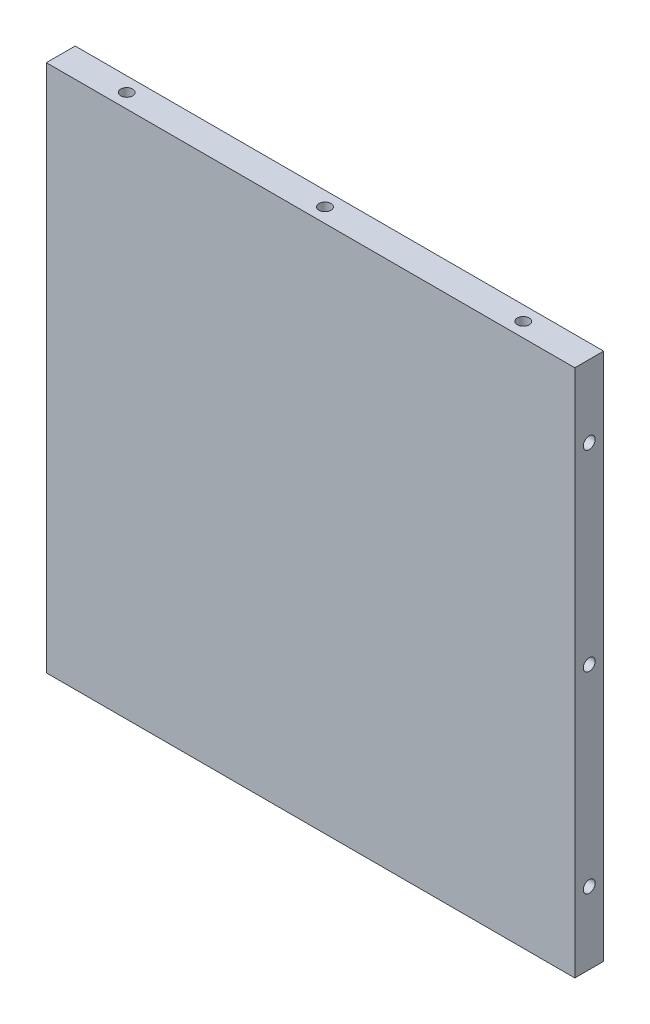
ISO-10303-21;
HEADER;
FILE_DESCRIPTION(('STEP AP214'),'2;1');
FILE_NAME('part.step','',(''),(''),'','','');
FILE_SCHEMA(('AUTOMOTIVE_DESIGN { 1 0 10303 214 1 1 1 1 }'));
ENDSEC;
DATA;
#1=APPLICATION_CONTEXT('core data for automotive mechanical design processes');
#2=APPLICATION_PROTOCOL_DEFINITION('international standard','automotive_design',2000,#1);
#3=PRODUCT_CONTEXT('',#1,'mechanical');
#4=PRODUCT('Part','Part','',(#3));
#5=PRODUCT_RELATED_PRODUCT_CATEGORY('part','',(#4));
#6=PRODUCT_DEFINITION_FORMATION('','',#4);
#7=PRODUCT_DEFINITION_CONTEXT('part definition',#1,'design');
#8=PRODUCT_DEFINITION('design','',#6,#7);
#9=PRODUCT_DEFINITION_SHAPE('','',#8);
#10=(LENGTH_UNIT() NAMED_UNIT(*) SI_UNIT(.MILLI.,.METRE.));
#11=(NAMED_UNIT(*) PLANE_ANGLE_UNIT() SI_UNIT($,.RADIAN.));
#12=(NAMED_UNIT(*) SI_UNIT($,.STERADIAN.) SOLID_ANGLE_UNIT());
#13=UNCERTAINTY_MEASURE_WITH_UNIT(LENGTH_MEASURE(1.E-05),#10,'distance_accuracy_value','');
#14=(GEOMETRIC_REPRESENTATION_CONTEXT(3) GLOBAL_UNCERTAINTY_ASSIGNED_CONTEXT((#13)) GLOBAL_UNIT_ASSIGNED_CONTEXT((#10,
#11,#12)) REPRESENTATION_CONTEXT('',''));
#15=CARTESIAN_POINT('',(0.,0.,0.));
#16=DIRECTION('',(0.,0.,1.));
#17=DIRECTION('',(1.,0.,0.));
#18=AXIS2_PLACEMENT_3D('',#15,#16,#17);
#19=CARTESIAN_POINT('',(128.3,146.6,4.));
#20=DIRECTION('',(0.,-1.,0.));
#21=DIRECTION('',(0.,0.,-1.));
#22=AXIS2_PLACEMENT_3D('',#19,#20,#21);
#23=CYLINDRICAL_SURFACE('',#22,1.65000000000002);
#24=CARTESIAN_POINT('',(128.3,15.,4.));
#25=DIRECTION('',(0.,-1.,0.));
#26=DIRECTION('',(1.,0.,0.));
#27=AXIS2_PLACEMENT_3D('',#24,#25,#26);
#28=CIRCLE('',#27,1.65000000000002);
#29=CARTESIAN_POINT('',(129.95,15.,4.));
#30=VERTEX_POINT('',#29);
#31=EDGE_CURVE('E146',#30,#30,#28,.F.);
#32=ORIENTED_EDGE('',*,*,#31,.T.);
#33=EDGE_LOOP('',(#32));
#34=FACE_BOUND('',#33,.T.);
#35=CARTESIAN_POINT('',(128.3,0.,4.));
#36=DIRECTION('',(0.,-1.,0.));
#37=DIRECTION('',(0.,0.,-1.));
#38=AXIS2_PLACEMENT_3D('',#35,#36,#37);
#39=CIRCLE('',#38,1.65000000000002);
#40=CARTESIAN_POINT('',(128.3,0.,2.34999999999998));
#41=VERTEX_POINT('',#40);
#42=EDGE_CURVE('E153',#41,#41,#39,.T.);
#43=ORIENTED_EDGE('',*,*,#42,.T.);
#44=EDGE_LOOP('',(#43));
#45=FACE_BOUND('',#44,.T.);
#46=ADVANCED_FACE('F37',(#34,#45),#23,.F.);
#47=CARTESIAN_POINT('',(73.3,146.6,4.));
#48=DIRECTION('',(0.,-1.,0.));
#49=DIRECTION('',(0.,0.,-1.));
#50=AXIS2_PLACEMENT_3D('',#47,#48,#49);
#51=CYLINDRICAL_SURFACE('',#50,1.64999999999999);
#52=CARTESIAN_POINT('',(73.3,15.,4.));
#53=DIRECTION('',(0.,-1.,0.));
#54=DIRECTION('',(1.,0.,0.));
#55=AXIS2_PLACEMENT_3D('',#52,#53,#54);
#56=CIRCLE('',#55,1.64999999999999);
#57=CARTESIAN_POINT('',(74.95,15.,4.));
#58=VERTEX_POINT('',#57);
#59=EDGE_CURVE('E143',#58,#58,#56,.F.);
#60=ORIENTED_EDGE('',*,*,#59,.T.);
#61=EDGE_LOOP('',(#60));
#62=FACE_BOUND('',#61,.T.);
#63=CARTESIAN_POINT('',(73.3,0.,4.));
#64=DIRECTION('',(0.,-1.,0.));
#65=DIRECTION('',(0.,0.,-1.));
#66=AXIS2_PLACEMENT_3D('',#63,#64,#65);
#67=CIRCLE('',#66,1.64999999999999);
#68=CARTESIAN_POINT('',(73.3,0.,2.35000000000001));
#69=VERTEX_POINT('',#68);
#70=EDGE_CURVE('E176',#69,#69,#67,.T.);
#71=ORIENTED_EDGE('',*,*,#70,.T.);
#72=EDGE_LOOP('',(#71));
#73=FACE_BOUND('',#72,.T.);
#74=ADVANCED_FACE('F201',(#62,#73),#51,.F.);
#75=CARTESIAN_POINT('',(18.3,146.6,4.));
#76=DIRECTION('',(0.,-1.,0.));
#77=DIRECTION('',(0.,0.,-1.));
#78=AXIS2_PLACEMENT_3D('',#75,#76,#77);
#79=CYLINDRICAL_SURFACE('',#78,1.65);
#80=CARTESIAN_POINT('',(18.3,15.,4.));
#81=DIRECTION('',(0.,-1.,0.));
#82=DIRECTION('',(1.,0.,0.));
#83=AXIS2_PLACEMENT_3D('',#80,#81,#82);
#84=CIRCLE('',#83,1.65);
#85=CARTESIAN_POINT('',(19.95,15.,4.));
#86=VERTEX_POINT('',#85);
#87=EDGE_CURVE('E140',#86,#86,#84,.F.);
#88=ORIENTED_EDGE('',*,*,#87,.T.);
#89=EDGE_LOOP('',(#88));
#90=FACE_BOUND('',#89,.T.);
#91=CARTESIAN_POINT('',(18.3,0.,4.));
#92=DIRECTION('',(0.,-1.,0.));
#93=DIRECTION('',(0.,0.,-1.));
#94=AXIS2_PLACEMENT_3D('',#91,#92,#93);
#95=CIRCLE('',#94,1.65);
#96=CARTESIAN_POINT('',(18.3,0.,2.35));
#97=VERTEX_POINT('',#96);
#98=EDGE_CURVE('E170',#97,#97,#95,.T.);
#99=ORIENTED_EDGE('',*,*,#98,.T.);
#100=EDGE_LOOP('',(#99));
#101=FACE_BOUND('',#100,.T.);
#102=ADVANCED_FACE('F196',(#90,#101),#79,.F.);
#103=CARTESIAN_POINT('',(0.,0.,8.));
#104=DIRECTION('',(1.,0.,0.));
#105=DIRECTION('',(0.,1.,0.));
#106=AXIS2_PLACEMENT_3D('',#103,#104,#105);
#107=PLANE('',#106);
#108=CARTESIAN_POINT('',(0.,20.,4.));
#109=DIRECTION('',(-1.,0.,0.));
#110=DIRECTION('',(0.,-1.,0.));
#111=AXIS2_PLACEMENT_3D('',#108,#109,#110);
#112=CIRCLE('',#111,1.65);
#113=CARTESIAN_POINT('',(0.,18.35,4.));
#114=VERTEX_POINT('',#113);
#115=EDGE_CURVE('E154',#114,#114,#112,.T.);
#116=ORIENTED_EDGE('',*,*,#115,.F.);
#117=EDGE_LOOP('',(#116));
#118=FACE_BOUND('',#117,.T.);
#119=CARTESIAN_POINT('',(0.,73.3,3.99999999999982));
#120=DIRECTION('',(-1.,0.,0.));
#121=DIRECTION('',(0.,-1.,0.));
#122=AXIS2_PLACEMENT_3D('',#119,#120,#121);
#123=CIRCLE('',#122,1.65);
#124=CARTESIAN_POINT('',(0.,71.65,3.99999999999982));
#125=VERTEX_POINT('',#124);
#126=EDGE_CURVE('E160',#125,#125,#123,.T.);
#127=ORIENTED_EDGE('',*,*,#126,.F.);
#128=EDGE_LOOP('',(#127));
#129=FACE_BOUND('',#128,.T.);
#130=CARTESIAN_POINT('',(0.,126.6,3.99999999999963));
#131=DIRECTION('',(-1.,0.,0.));
#132=DIRECTION('',(0.,-1.,0.));
#133=AXIS2_PLACEMENT_3D('',#130,#131,#132);
#134=CIRCLE('',#133,1.65);
#135=CARTESIAN_POINT('',(0.,124.95,3.99999999999963));
#136=VERTEX_POINT('',#135);
#137=EDGE_CURVE('E149',#136,#136,#134,.T.);
#138=ORIENTED_EDGE('',*,*,#137,.F.);
#139=EDGE_LOOP('',(#138));
#140=FACE_BOUND('',#139,.T.);
#141=DIRECTION('',(0.,-1.,0.));
#142=VECTOR('',#141,1.);
#143=CARTESIAN_POINT('',(0.,0.,0.));
#144=LINE('',#143,#142);
#145=CARTESIAN_POINT('',(0.,146.6,0.));
#146=VERTEX_POINT('',#145);
#147=CARTESIAN_POINT('',(0.,0.,0.));
#148=VERTEX_POINT('',#147);
#149=EDGE_CURVE('E104',#146,#148,#144,.T.);
#150=ORIENTED_EDGE('',*,*,#149,.T.);
#151=DIRECTION('',(0.,0.,-1.));
#152=VECTOR('',#151,1.);
#153=CARTESIAN_POINT('',(0.,0.,8.));
#154=LINE('',#153,#152);
#155=CARTESIAN_POINT('',(0.,0.,8.));
#156=VERTEX_POINT('',#155);
#157=EDGE_CURVE('E11',#156,#148,#154,.T.);
#158=ORIENTED_EDGE('',*,*,#157,.F.);
#159=DIRECTION('',(0.,-1.,0.));
#160=VECTOR('',#159,1.);
#161=CARTESIAN_POINT('',(0.,0.,8.));
#162=LINE('',#161,#160);
#163=CARTESIAN_POINT('',(0.,146.6,8.));
#164=VERTEX_POINT('',#163);
#165=EDGE_CURVE('E91',#164,#156,#162,.T.);
#166=ORIENTED_EDGE('',*,*,#165,.F.);
#167=DIRECTION('',(0.,0.,-1.));
#168=VECTOR('',#167,1.);
#169=CARTESIAN_POINT('',(0.,146.6,8.));
#170=LINE('',#169,#168);
#171=EDGE_CURVE('E100',#164,#146,#170,.T.);
#172=ORIENTED_EDGE('',*,*,#171,.T.);
#173=EDGE_LOOP('',(#150,#158,#166,#172));
#174=FACE_BOUND('',#173,.T.);
#175=ADVANCED_FACE('F39',(#118,#129,#140,#174),#107,.F.);
#176=CARTESIAN_POINT('',(0.,0.,8.));
#177=DIRECTION('',(0.,1.,0.));
#178=DIRECTION('',(0.,0.,1.));
#179=AXIS2_PLACEMENT_3D('',#176,#177,#178);
#180=PLANE('',#179);
#181=ORIENTED_EDGE('',*,*,#98,.F.);
#182=EDGE_LOOP('',(#181));
#183=FACE_BOUND('',#182,.T.);
#184=ORIENTED_EDGE('',*,*,#70,.F.);
#185=EDGE_LOOP('',(#184));
#186=FACE_BOUND('',#185,.T.);
#187=ORIENTED_EDGE('',*,*,#42,.F.);
#188=EDGE_LOOP('',(#187));
#189=FACE_BOUND('',#188,.T.);
#190=DIRECTION('',(1.,0.,0.));
#191=VECTOR('',#190,1.);
#192=CARTESIAN_POINT('',(0.,0.,0.));
#193=LINE('',#192,#191);
#194=CARTESIAN_POINT('',(146.6,0.,0.));
#195=VERTEX_POINT('',#194);
#196=EDGE_CURVE('E95',#148,#195,#193,.T.);
#197=ORIENTED_EDGE('',*,*,#196,.T.);
#198=DIRECTION('',(0.,0.,-1.));
#199=VECTOR('',#198,1.);
#200=CARTESIAN_POINT('',(146.6,0.,8.));
#201=LINE('',#200,#199);
#202=CARTESIAN_POINT('',(146.6,0.,8.));
#203=VERTEX_POINT('',#202);
#204=EDGE_CURVE('E47',#203,#195,#201,.T.);
#205=ORIENTED_EDGE('',*,*,#204,.F.);
#206=DIRECTION('',(1.,0.,0.));
#207=VECTOR('',#206,1.);
#208=CARTESIAN_POINT('',(0.,0.,8.));
#209=LINE('',#208,#207);
#210=EDGE_CURVE('E86',#156,#203,#209,.T.);
#211=ORIENTED_EDGE('',*,*,#210,.F.);
#212=ORIENTED_EDGE('',*,*,#157,.T.);
#213=EDGE_LOOP('',(#197,#205,#211,#212));
#214=FACE_BOUND('',#213,.T.);
#215=ADVANCED_FACE('F94',(#183,#186,#189,#214),#180,.F.);
#216=CARTESIAN_POINT('',(146.6,0.,8.));
#217=DIRECTION('',(-1.,0.,0.));
#218=DIRECTION('',(0.,-1.,0.));
#219=AXIS2_PLACEMENT_3D('',#216,#217,#218);
#220=PLANE('',#219);
#221=CARTESIAN_POINT('',(146.6,20.,4.));
#222=DIRECTION('',(-1.,0.,0.));
#223=DIRECTION('',(0.,-1.,0.));
#224=AXIS2_PLACEMENT_3D('',#221,#222,#223);
#225=CIRCLE('',#224,1.65);
#226=CARTESIAN_POINT('',(146.6,18.35,4.));
#227=VERTEX_POINT('',#226);
#228=EDGE_CURVE('E150',#227,#227,#225,.T.);
#229=ORIENTED_EDGE('',*,*,#228,.T.);
#230=EDGE_LOOP('',(#229));
#231=FACE_BOUND('',#230,.T.);
#232=CARTESIAN_POINT('',(146.6,73.3,3.99999999999982));
#233=DIRECTION('',(-1.,0.,0.));
#234=DIRECTION('',(0.,-1.,0.));
#235=AXIS2_PLACEMENT_3D('',#232,#233,#234);
#236=CIRCLE('',#235,1.65);
#237=CARTESIAN_POINT('',(146.6,71.65,3.99999999999982));
#238=VERTEX_POINT('',#237);
#239=EDGE_CURVE('E157',#238,#238,#236,.T.);
#240=ORIENTED_EDGE('',*,*,#239,.T.);
#241=EDGE_LOOP('',(#240));
#242=FACE_BOUND('',#241,.T.);
#243=CARTESIAN_POINT('',(146.6,126.6,3.99999999999963));
#244=DIRECTION('',(-1.,0.,0.));
#245=DIRECTION('',(0.,-1.,0.));
#246=AXIS2_PLACEMENT_3D('',#243,#244,#245);
#247=CIRCLE('',#246,1.65);
#248=CARTESIAN_POINT('',(146.6,124.95,3.99999999999963));
#249=VERTEX_POINT('',#248);
#250=EDGE_CURVE('E163',#249,#249,#247,.T.);
#251=ORIENTED_EDGE('',*,*,#250,.T.);
#252=EDGE_LOOP('',(#251));
#253=FACE_BOUND('',#252,.T.);
#254=DIRECTION('',(0.,1.,0.));
#255=VECTOR('',#254,1.);
#256=CARTESIAN_POINT('',(146.6,0.,0.));
#257=LINE('',#256,#255);
#258=CARTESIAN_POINT('',(146.6,146.6,0.));
#259=VERTEX_POINT('',#258);
#260=EDGE_CURVE('E73',#195,#259,#257,.T.);
#261=ORIENTED_EDGE('',*,*,#260,.T.);
#262=DIRECTION('',(0.,0.,-1.));
#263=VECTOR('',#262,1.);
#264=CARTESIAN_POINT('',(146.6,146.6,8.));
#265=LINE('',#264,#263);
#266=CARTESIAN_POINT('',(146.6,146.6,8.));
#267=VERTEX_POINT('',#266);
#268=EDGE_CURVE('E96',#267,#259,#265,.T.);
#269=ORIENTED_EDGE('',*,*,#268,.F.);
#270=DIRECTION('',(0.,1.,0.));
#271=VECTOR('',#270,1.);
#272=CARTESIAN_POINT('',(146.6,0.,8.));
#273=LINE('',#272,#271);
#274=EDGE_CURVE('E89',#203,#267,#273,.T.);
#275=ORIENTED_EDGE('',*,*,#274,.F.);
#276=ORIENTED_EDGE('',*,*,#204,.T.);
#277=EDGE_LOOP('',(#261,#269,#275,#276));
#278=FACE_BOUND('',#277,.T.);
#279=ADVANCED_FACE('F98',(#231,#242,#253,#278),#220,.F.);
#280=CARTESIAN_POINT('',(0.,146.6,8.));
#281=DIRECTION('',(0.,-1.,0.));
#282=DIRECTION('',(0.,0.,-1.));
#283=AXIS2_PLACEMENT_3D('',#280,#281,#282);
#284=PLANE('',#283);
#285=CARTESIAN_POINT('',(18.3,146.6,4.));
#286=DIRECTION('',(0.,-1.,0.));
#287=DIRECTION('',(0.,0.,-1.));
#288=AXIS2_PLACEMENT_3D('',#285,#286,#287);
#289=CIRCLE('',#288,1.65);
#290=CARTESIAN_POINT('',(18.3,146.6,2.35));
#291=VERTEX_POINT('',#290);
#292=EDGE_CURVE('E107',#291,#291,#289,.T.);
#293=ORIENTED_EDGE('',*,*,#292,.T.);
#294=EDGE_LOOP('',(#293));
#295=FACE_BOUND('',#294,.T.);
#296=CARTESIAN_POINT('',(73.3,146.6,4.));
#297=DIRECTION('',(0.,-1.,0.));
#298=DIRECTION('',(0.,0.,-1.));
#299=AXIS2_PLACEMENT_3D('',#296,#297,#298);
#300=CIRCLE('',#299,1.64999999999999);
#301=CARTESIAN_POINT('',(73.3,146.6,2.35000000000001));
#302=VERTEX_POINT('',#301);
#303=EDGE_CURVE('E173',#302,#302,#300,.T.);
#304=ORIENTED_EDGE('',*,*,#303,.T.);
#305=EDGE_LOOP('',(#304));
#306=FACE_BOUND('',#305,.T.);
#307=CARTESIAN_POINT('',(128.3,146.6,4.));
#308=DIRECTION('',(0.,-1.,0.));
#309=DIRECTION('',(0.,0.,-1.));
#310=AXIS2_PLACEMENT_3D('',#307,#308,#309);
#311=CIRCLE('',#310,1.65000000000002);
#312=CARTESIAN_POINT('',(128.3,146.6,2.34999999999998));
#313=VERTEX_POINT('',#312);
#314=EDGE_CURVE('E179',#313,#313,#311,.T.);
#315=ORIENTED_EDGE('',*,*,#314,.T.);
#316=EDGE_LOOP('',(#315));
#317=FACE_BOUND('',#316,.T.);
#318=DIRECTION('',(-1.,0.,0.));
#319=VECTOR('',#318,1.);
#320=CARTESIAN_POINT('',(0.,146.6,0.));
#321=LINE('',#320,#319);
#322=EDGE_CURVE('E79',#259,#146,#321,.T.);
#323=ORIENTED_EDGE('',*,*,#322,.T.);
#324=ORIENTED_EDGE('',*,*,#171,.F.);
#325=DIRECTION('',(-1.,0.,0.));
#326=VECTOR('',#325,1.);
#327=CARTESIAN_POINT('',(0.,146.6,8.));
#328=LINE('',#327,#326);
#329=EDGE_CURVE('E56',#267,#164,#328,.T.);
#330=ORIENTED_EDGE('',*,*,#329,.F.);
#331=ORIENTED_EDGE('',*,*,#268,.T.);
#332=EDGE_LOOP('',(#323,#324,#330,#331));
#333=FACE_BOUND('',#332,.T.);
#334=ADVANCED_FACE('F192',(#295,#306,#317,#333),#284,.F.);
#335=CARTESIAN_POINT('',(0.,0.,8.));
#336=DIRECTION('',(0.,0.,-1.));
#337=DIRECTION('',(-1.,0.,0.));
#338=AXIS2_PLACEMENT_3D('',#335,#336,#337);
#339=PLANE('',#338);
#340=ORIENTED_EDGE('',*,*,#165,.T.);
#341=ORIENTED_EDGE('',*,*,#210,.T.);
#342=ORIENTED_EDGE('',*,*,#274,.T.);
#343=ORIENTED_EDGE('',*,*,#329,.T.);
#344=EDGE_LOOP('',(#340,#341,#342,#343));
#345=FACE_BOUND('',#344,.T.);
#346=ADVANCED_FACE('F87',(#345),#339,.F.);
#347=CARTESIAN_POINT('',(0.,0.,0.));
#348=DIRECTION('',(0.,0.,-1.));
#349=DIRECTION('',(-1.,0.,0.));
#350=AXIS2_PLACEMENT_3D('',#347,#348,#349);
#351=PLANE('',#350);
#352=ORIENTED_EDGE('',*,*,#149,.F.);
#353=ORIENTED_EDGE('',*,*,#322,.F.);
#354=ORIENTED_EDGE('',*,*,#260,.F.);
#355=ORIENTED_EDGE('',*,*,#196,.F.);
#356=EDGE_LOOP('',(#352,#353,#354,#355));
#357=FACE_BOUND('',#356,.T.);
#358=ADVANCED_FACE('F214',(#357),#351,.T.);
#359=CARTESIAN_POINT('',(128.3,131.6,4.));
#360=DIRECTION('',(0.,1.,0.));
#361=DIRECTION('',(0.,0.,1.));
#362=AXIS2_PLACEMENT_3D('',#359,#360,#361);
#363=CIRCLE('',#362,1.65000000000002);
#364=CARTESIAN_POINT('',(128.3,131.6,5.65000000000002));
#365=VERTEX_POINT('',#364);
#366=EDGE_CURVE('E137',#365,#365,#363,.F.);
#367=ORIENTED_EDGE('',*,*,#366,.T.);
#368=EDGE_LOOP('',(#367));
#369=FACE_BOUND('',#368,.T.);
#370=ORIENTED_EDGE('',*,*,#314,.F.);
#371=EDGE_LOOP('',(#370));
#372=FACE_BOUND('',#371,.T.);
#373=ADVANCED_FACE('F204',(#369,#372),#23,.F.);
#374=CARTESIAN_POINT('',(73.3,131.6,4.));
#375=DIRECTION('',(0.,1.,0.));
#376=DIRECTION('',(0.,0.,1.));
#377=AXIS2_PLACEMENT_3D('',#374,#375,#376);
#378=CIRCLE('',#377,1.64999999999999);
#379=CARTESIAN_POINT('',(73.3,131.6,5.64999999999999));
#380=VERTEX_POINT('',#379);
#381=EDGE_CURVE('E134',#380,#380,#378,.F.);
#382=ORIENTED_EDGE('',*,*,#381,.T.);
#383=EDGE_LOOP('',(#382));
#384=FACE_BOUND('',#383,.T.);
#385=ORIENTED_EDGE('',*,*,#303,.F.);
#386=EDGE_LOOP('',(#385));
#387=FACE_BOUND('',#386,.T.);
#388=ADVANCED_FACE('F211',(#384,#387),#51,.F.);
#389=CARTESIAN_POINT('',(18.3,131.6,4.));
#390=DIRECTION('',(0.,1.,0.));
#391=DIRECTION('',(0.,0.,1.));
#392=AXIS2_PLACEMENT_3D('',#389,#390,#391);
#393=CIRCLE('',#392,1.65);
#394=CARTESIAN_POINT('',(18.3,131.6,5.65));
#395=VERTEX_POINT('',#394);
#396=EDGE_CURVE('E41',#395,#395,#393,.F.);
#397=ORIENTED_EDGE('',*,*,#396,.T.);
#398=EDGE_LOOP('',(#397));
#399=FACE_BOUND('',#398,.T.);
#400=ORIENTED_EDGE('',*,*,#292,.F.);
#401=EDGE_LOOP('',(#400));
#402=FACE_BOUND('',#401,.T.);
#403=ADVANCED_FACE('F220',(#399,#402),#79,.F.);
#404=CARTESIAN_POINT('',(146.6,126.6,3.99999999999963));
#405=DIRECTION('',(-1.,0.,0.));
#406=DIRECTION('',(0.,-1.,0.));
#407=AXIS2_PLACEMENT_3D('',#404,#405,#406);
#408=CYLINDRICAL_SURFACE('',#407,1.65);
#409=CARTESIAN_POINT('',(14.9999999999999,126.6,3.99999999999963));
#410=DIRECTION('',(-1.,0.,0.));
#411=DIRECTION('',(0.,-1.,0.));
#412=AXIS2_PLACEMENT_3D('',#409,#410,#411);
#413=CIRCLE('',#412,1.65);
#414=CARTESIAN_POINT('',(14.9999999999999,124.95,3.99999999999963));
#415=VERTEX_POINT('',#414);
#416=EDGE_CURVE('E123',#415,#415,#413,.F.);
#417=ORIENTED_EDGE('',*,*,#416,.T.);
#418=EDGE_LOOP('',(#417));
#419=FACE_BOUND('',#418,.T.);
#420=ORIENTED_EDGE('',*,*,#137,.T.);
#421=EDGE_LOOP('',(#420));
#422=FACE_BOUND('',#421,.T.);
#423=ADVANCED_FACE('F240',(#419,#422),#408,.F.);
#424=CARTESIAN_POINT('',(146.6,73.3,3.99999999999982));
#425=DIRECTION('',(-1.,0.,0.));
#426=DIRECTION('',(0.,-1.,0.));
#427=AXIS2_PLACEMENT_3D('',#424,#425,#426);
#428=CYLINDRICAL_SURFACE('',#427,1.65);
#429=CARTESIAN_POINT('',(14.9999999999999,73.3,3.99999999999982));
#430=DIRECTION('',(-1.,0.,0.));
#431=DIRECTION('',(0.,-1.,0.));
#432=AXIS2_PLACEMENT_3D('',#429,#430,#431);
#433=CIRCLE('',#432,1.65);
#434=CARTESIAN_POINT('',(14.9999999999999,71.65,3.99999999999982));
#435=VERTEX_POINT('',#434);
#436=EDGE_CURVE('E118',#435,#435,#433,.F.);
#437=ORIENTED_EDGE('',*,*,#436,.T.);
#438=EDGE_LOOP('',(#437));
#439=FACE_BOUND('',#438,.T.);
#440=ORIENTED_EDGE('',*,*,#126,.T.);
#441=EDGE_LOOP('',(#440));
#442=FACE_BOUND('',#441,.T.);
#443=ADVANCED_FACE('F246',(#439,#442),#428,.F.);
#444=CARTESIAN_POINT('',(146.6,20.,4.));
#445=DIRECTION('',(-1.,0.,0.));
#446=DIRECTION('',(0.,-1.,0.));
#447=AXIS2_PLACEMENT_3D('',#444,#445,#446);
#448=CYLINDRICAL_SURFACE('',#447,1.65);
#449=CARTESIAN_POINT('',(14.9999999999999,20.,4.));
#450=DIRECTION('',(-1.,0.,0.));
#451=DIRECTION('',(0.,-1.,0.));
#452=AXIS2_PLACEMENT_3D('',#449,#450,#451);
#453=CIRCLE('',#452,1.65);
#454=CARTESIAN_POINT('',(14.9999999999999,18.35,4.));
#455=VERTEX_POINT('',#454);
#456=EDGE_CURVE('E116',#455,#455,#453,.F.);
#457=ORIENTED_EDGE('',*,*,#456,.T.);
#458=EDGE_LOOP('',(#457));
#459=FACE_BOUND('',#458,.T.);
#460=ORIENTED_EDGE('',*,*,#115,.T.);
#461=EDGE_LOOP('',(#460));
#462=FACE_BOUND('',#461,.T.);
#463=ADVANCED_FACE('F376',(#459,#462),#448,.F.);
#464=CARTESIAN_POINT('',(131.6,126.6,3.99999999999963));
#465=DIRECTION('',(1.,0.,0.));
#466=DIRECTION('',(0.,1.,0.));
#467=AXIS2_PLACEMENT_3D('',#464,#465,#466);
#468=CIRCLE('',#467,1.65);
#469=CARTESIAN_POINT('',(131.6,128.25,3.99999999999963));
#470=VERTEX_POINT('',#469);
#471=EDGE_CURVE('E119',#470,#470,#468,.F.);
#472=ORIENTED_EDGE('',*,*,#471,.T.);
#473=EDGE_LOOP('',(#472));
#474=FACE_BOUND('',#473,.T.);
#475=ORIENTED_EDGE('',*,*,#250,.F.);
#476=EDGE_LOOP('',(#475));
#477=FACE_BOUND('',#476,.T.);
#478=ADVANCED_FACE('F249',(#474,#477),#408,.F.);
#479=CARTESIAN_POINT('',(131.6,73.3,3.99999999999982));
#480=DIRECTION('',(1.,0.,0.));
#481=DIRECTION('',(0.,1.,0.));
#482=AXIS2_PLACEMENT_3D('',#479,#480,#481);
#483=CIRCLE('',#482,1.65);
#484=CARTESIAN_POINT('',(131.6,74.95,3.99999999999982));
#485=VERTEX_POINT('',#484);
#486=EDGE_CURVE('E115',#485,#485,#483,.F.);
#487=ORIENTED_EDGE('',*,*,#486,.T.);
#488=EDGE_LOOP('',(#487));
#489=FACE_BOUND('',#488,.T.);
#490=ORIENTED_EDGE('',*,*,#239,.F.);
#491=EDGE_LOOP('',(#490));
#492=FACE_BOUND('',#491,.T.);
#493=ADVANCED_FACE('F374',(#489,#492),#428,.F.);
#494=CARTESIAN_POINT('',(131.6,20.,4.));
#495=DIRECTION('',(1.,0.,0.));
#496=DIRECTION('',(0.,1.,0.));
#497=AXIS2_PLACEMENT_3D('',#494,#495,#496);
#498=CIRCLE('',#497,1.65);
#499=CARTESIAN_POINT('',(131.6,21.65,4.));
#500=VERTEX_POINT('',#499);
#501=EDGE_CURVE('E113',#500,#500,#498,.F.);
#502=ORIENTED_EDGE('',*,*,#501,.T.);
#503=EDGE_LOOP('',(#502));
#504=FACE_BOUND('',#503,.T.);
#505=ORIENTED_EDGE('',*,*,#228,.F.);
#506=EDGE_LOOP('',(#505));
#507=FACE_BOUND('',#506,.T.);
#508=ADVANCED_FACE('F365',(#504,#507),#448,.F.);
#509=CARTESIAN_POINT('',(131.6,131.6,-164.897301372703));
#510=DIRECTION('',(1.,0.,0.));
#511=DIRECTION('',(0.,1.,0.));
#512=AXIS2_PLACEMENT_3D('',#509,#510,#511);
#513=PLANE('',#512);
#514=ORIENTED_EDGE('',*,*,#501,.F.);
#515=EDGE_LOOP('',(#514));
#516=FACE_BOUND('',#515,.T.);
#517=ADVANCED_FACE('F349',(#516),#513,.T.);
#518=ORIENTED_EDGE('',*,*,#486,.F.);
#519=EDGE_LOOP('',(#518));
#520=FACE_BOUND('',#519,.T.);
#521=ADVANCED_FACE('F347',(#520),#513,.T.);
#522=ORIENTED_EDGE('',*,*,#471,.F.);
#523=EDGE_LOOP('',(#522));
#524=FACE_BOUND('',#523,.T.);
#525=ADVANCED_FACE('F338',(#524),#513,.T.);
#526=CARTESIAN_POINT('',(14.9999999999999,131.6,-164.897301372703));
#527=DIRECTION('',(-1.,0.,0.));
#528=DIRECTION('',(0.,-1.,0.));
#529=AXIS2_PLACEMENT_3D('',#526,#527,#528);
#530=PLANE('',#529);
#531=ORIENTED_EDGE('',*,*,#456,.F.);
#532=EDGE_LOOP('',(#531));
#533=FACE_BOUND('',#532,.T.);
#534=ADVANCED_FACE('F322',(#533),#530,.T.);
#535=ORIENTED_EDGE('',*,*,#436,.F.);
#536=EDGE_LOOP('',(#535));
#537=FACE_BOUND('',#536,.T.);
#538=ADVANCED_FACE('F319',(#537),#530,.T.);
#539=ORIENTED_EDGE('',*,*,#416,.F.);
#540=EDGE_LOOP('',(#539));
#541=FACE_BOUND('',#540,.T.);
#542=ADVANCED_FACE('F310',(#541),#530,.T.);
#543=CARTESIAN_POINT('',(14.9999999999999,131.6,-164.897301372703));
#544=DIRECTION('',(0.,1.,0.));
#545=DIRECTION('',(0.,0.,1.));
#546=AXIS2_PLACEMENT_3D('',#543,#544,#545);
#547=PLANE('',#546);
#548=ORIENTED_EDGE('',*,*,#396,.F.);
#549=EDGE_LOOP('',(#548));
#550=FACE_BOUND('',#549,.T.);
#551=ADVANCED_FACE('F271',(#550),#547,.T.);
#552=ORIENTED_EDGE('',*,*,#381,.F.);
#553=EDGE_LOOP('',(#552));
#554=FACE_BOUND('',#553,.T.);
#555=ADVANCED_FACE('F268',(#554),#547,.T.);
#556=ORIENTED_EDGE('',*,*,#366,.F.);
#557=EDGE_LOOP('',(#556));
#558=FACE_BOUND('',#557,.T.);
#559=ADVANCED_FACE('F260',(#558),#547,.T.);
#560=CARTESIAN_POINT('',(15.,15.,-164.897301372703));
#561=DIRECTION('',(0.,-1.,0.));
#562=DIRECTION('',(1.,0.,0.));
#563=AXIS2_PLACEMENT_3D('',#560,#561,#562);
#564=PLANE('',#563);
#565=ORIENTED_EDGE('',*,*,#87,.F.);
#566=EDGE_LOOP('',(#565));
#567=FACE_BOUND('',#566,.T.);
#568=ADVANCED_FACE('F257',(#567),#564,.T.);
#569=ORIENTED_EDGE('',*,*,#59,.F.);
#570=EDGE_LOOP('',(#569));
#571=FACE_BOUND('',#570,.T.);
#572=ADVANCED_FACE('F259',(#571),#564,.T.);
#573=ORIENTED_EDGE('',*,*,#31,.F.);
#574=EDGE_LOOP('',(#573));
#575=FACE_BOUND('',#574,.T.);
#576=ADVANCED_FACE('F262',(#575),#564,.T.);
#577=CLOSED_SHELL('',(#46,#74,#102,#175,#215,#279,#334,#346,#358,#373,#388,#403,#423,#443,#463,
#478,#493,#508,#517,#521,#525,#534,#538,#542,#551,#555,#559,#568,#572,#576));
#578=MANIFOLD_SOLID_BREP('B2',#577);
#579=ADVANCED_BREP_SHAPE_REPRESENTATION('',(#18,#578),#14);
#580=SHAPE_DEFINITION_REPRESENTATION(#9,#579);
ENDSEC;
END-ISO-10303-21;
